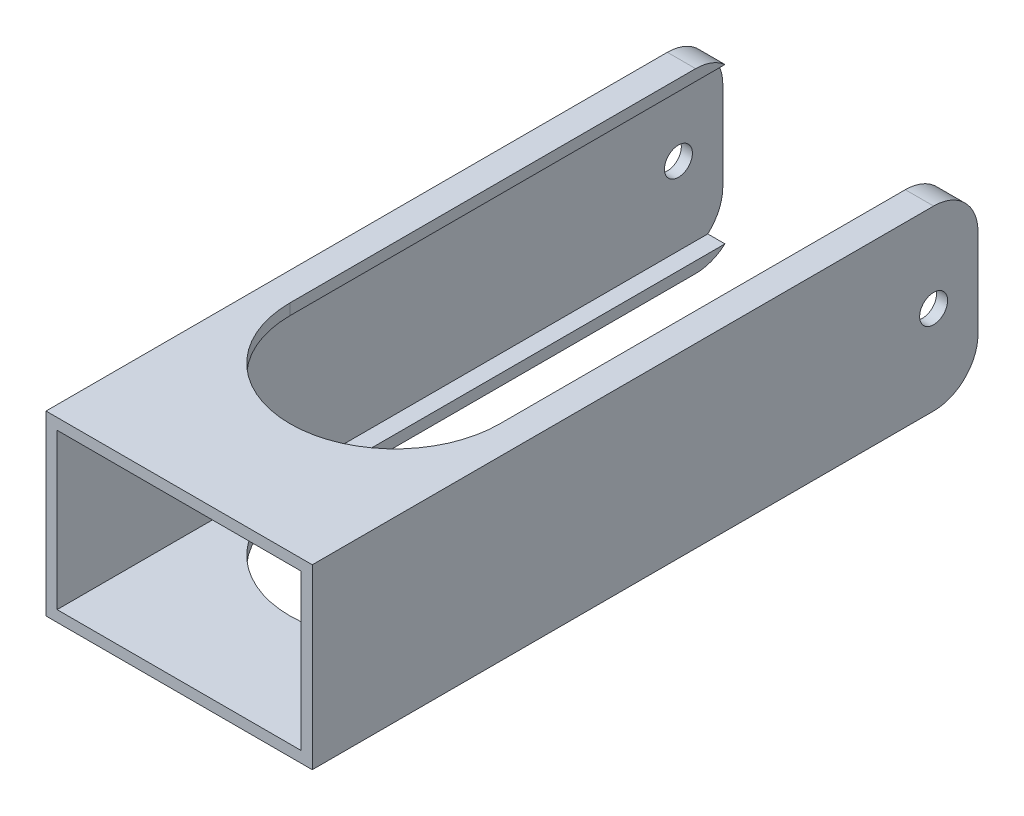
ISO-10303-21;
HEADER;
FILE_DESCRIPTION(('STEP AP214'),'2;1');
FILE_NAME('part.step','',(''),(''),'','','');
FILE_SCHEMA(('AUTOMOTIVE_DESIGN { 1 0 10303 214 1 1 1 1 }'));
ENDSEC;
DATA;
#1=APPLICATION_CONTEXT('core data for automotive mechanical design processes');
#2=APPLICATION_PROTOCOL_DEFINITION('international standard','automotive_design',2000,#1);
#3=PRODUCT_CONTEXT('',#1,'mechanical');
#4=PRODUCT('Part','Part','',(#3));
#5=PRODUCT_RELATED_PRODUCT_CATEGORY('part','',(#4));
#6=PRODUCT_DEFINITION_FORMATION('','',#4);
#7=PRODUCT_DEFINITION_CONTEXT('part definition',#1,'design');
#8=PRODUCT_DEFINITION('design','',#6,#7);
#9=PRODUCT_DEFINITION_SHAPE('','',#8);
#10=(LENGTH_UNIT() NAMED_UNIT(*) SI_UNIT(.MILLI.,.METRE.));
#11=(NAMED_UNIT(*) PLANE_ANGLE_UNIT() SI_UNIT($,.RADIAN.));
#12=(NAMED_UNIT(*) SI_UNIT($,.STERADIAN.) SOLID_ANGLE_UNIT());
#13=UNCERTAINTY_MEASURE_WITH_UNIT(LENGTH_MEASURE(1.E-05),#10,'distance_accuracy_value','');
#14=(GEOMETRIC_REPRESENTATION_CONTEXT(3) GLOBAL_UNCERTAINTY_ASSIGNED_CONTEXT((#13)) GLOBAL_UNIT_ASSIGNED_CONTEXT((#10,
#11,#12)) REPRESENTATION_CONTEXT('',''));
#15=CARTESIAN_POINT('',(0.,0.,0.));
#16=DIRECTION('',(0.,0.,1.));
#17=DIRECTION('',(1.,0.,0.));
#18=AXIS2_PLACEMENT_3D('',#15,#16,#17);
#19=CARTESIAN_POINT('',(0.,0.,-95.25));
#20=DIRECTION('',(0.,0.,1.));
#21=DIRECTION('',(1.,0.,0.));
#22=AXIS2_PLACEMENT_3D('',#19,#20,#21);
#23=PLANE('',#22);
#24=DIRECTION('',(0.,1.,0.));
#25=VECTOR('',#24,1.);
#26=CARTESIAN_POINT('',(38.1,-25.4,-95.25));
#27=LINE('',#26,#25);
#28=CARTESIAN_POINT('',(38.1,-12.7,-95.25));
#29=VERTEX_POINT('',#28);
#30=CARTESIAN_POINT('',(38.1,12.7,-95.25));
#31=VERTEX_POINT('',#30);
#32=EDGE_CURVE('E267',#29,#31,#27,.T.);
#33=ORIENTED_EDGE('',*,*,#32,.F.);
#34=DIRECTION('',(1.,0.,0.));
#35=VECTOR('',#34,1.);
#36=CARTESIAN_POINT('',(0.,-12.7,-95.25));
#37=LINE('',#36,#35);
#38=CARTESIAN_POINT('',(34.925,-12.7,-95.25));
#39=VERTEX_POINT('',#38);
#40=EDGE_CURVE('E65',#29,#39,#37,.F.);
#41=ORIENTED_EDGE('',*,*,#40,.T.);
#42=DIRECTION('',(0.,1.,0.));
#43=VECTOR('',#42,1.);
#44=CARTESIAN_POINT('',(34.925,-22.225,-95.25));
#45=LINE('',#44,#43);
#46=CARTESIAN_POINT('',(34.925,12.7,-95.25));
#47=VERTEX_POINT('',#46);
#48=EDGE_CURVE('E261',#39,#47,#45,.T.);
#49=ORIENTED_EDGE('',*,*,#48,.T.);
#50=DIRECTION('',(-1.,0.,0.));
#51=VECTOR('',#50,1.);
#52=CARTESIAN_POINT('',(0.,12.7,-95.25));
#53=LINE('',#52,#51);
#54=EDGE_CURVE('E380',#47,#31,#53,.F.);
#55=ORIENTED_EDGE('',*,*,#54,.T.);
#56=EDGE_LOOP('',(#33,#41,#49,#55));
#57=FACE_BOUND('',#56,.T.);
#58=ADVANCED_FACE('F40',(#57),#23,.F.);
#59=CARTESIAN_POINT('',(0.,0.,95.25));
#60=DIRECTION('',(0.,0.,1.));
#61=DIRECTION('',(1.,0.,0.));
#62=AXIS2_PLACEMENT_3D('',#59,#60,#61);
#63=PLANE('',#62);
#64=DIRECTION('',(0.,-1.,0.));
#65=VECTOR('',#64,1.);
#66=CARTESIAN_POINT('',(-38.1,-25.4,95.25));
#67=LINE('',#66,#65);
#68=CARTESIAN_POINT('',(-38.1,25.4,95.25));
#69=VERTEX_POINT('',#68);
#70=CARTESIAN_POINT('',(-38.1,-25.4,95.25));
#71=VERTEX_POINT('',#70);
#72=EDGE_CURVE('E295',#69,#71,#67,.T.);
#73=ORIENTED_EDGE('',*,*,#72,.T.);
#74=DIRECTION('',(1.,0.,0.));
#75=VECTOR('',#74,1.);
#76=CARTESIAN_POINT('',(38.1,-25.4,95.25));
#77=LINE('',#76,#75);
#78=CARTESIAN_POINT('',(38.1,-25.4,95.25));
#79=VERTEX_POINT('',#78);
#80=EDGE_CURVE('E298',#71,#79,#77,.T.);
#81=ORIENTED_EDGE('',*,*,#80,.T.);
#82=DIRECTION('',(0.,1.,0.));
#83=VECTOR('',#82,1.);
#84=CARTESIAN_POINT('',(38.1,-25.4,95.25));
#85=LINE('',#84,#83);
#86=CARTESIAN_POINT('',(38.1,25.4,95.25));
#87=VERTEX_POINT('',#86);
#88=EDGE_CURVE('E300',#79,#87,#85,.T.);
#89=ORIENTED_EDGE('',*,*,#88,.T.);
#90=DIRECTION('',(-1.,0.,0.));
#91=VECTOR('',#90,1.);
#92=CARTESIAN_POINT('',(38.1,25.4,95.25));
#93=LINE('',#92,#91);
#94=EDGE_CURVE('E302',#87,#69,#93,.T.);
#95=ORIENTED_EDGE('',*,*,#94,.T.);
#96=EDGE_LOOP('',(#73,#81,#89,#95));
#97=FACE_BOUND('',#96,.T.);
#98=DIRECTION('',(1.,0.,0.));
#99=VECTOR('',#98,1.);
#100=CARTESIAN_POINT('',(34.925,-22.225,95.25));
#101=LINE('',#100,#99);
#102=CARTESIAN_POINT('',(-34.925,-22.225,95.25));
#103=VERTEX_POINT('',#102);
#104=CARTESIAN_POINT('',(34.925,-22.225,95.25));
#105=VERTEX_POINT('',#104);
#106=EDGE_CURVE('E273',#103,#105,#101,.T.);
#107=ORIENTED_EDGE('',*,*,#106,.F.);
#108=DIRECTION('',(0.,-1.,0.));
#109=VECTOR('',#108,1.);
#110=CARTESIAN_POINT('',(-34.925,-22.225,95.25));
#111=LINE('',#110,#109);
#112=CARTESIAN_POINT('',(-34.925,22.225,95.25));
#113=VERTEX_POINT('',#112);
#114=EDGE_CURVE('E271',#113,#103,#111,.T.);
#115=ORIENTED_EDGE('',*,*,#114,.F.);
#116=DIRECTION('',(-1.,0.,0.));
#117=VECTOR('',#116,1.);
#118=CARTESIAN_POINT('',(34.925,22.225,95.25));
#119=LINE('',#118,#117);
#120=CARTESIAN_POINT('',(34.925,22.225,95.25));
#121=VERTEX_POINT('',#120);
#122=EDGE_CURVE('E278',#121,#113,#119,.T.);
#123=ORIENTED_EDGE('',*,*,#122,.F.);
#124=DIRECTION('',(0.,1.,0.));
#125=VECTOR('',#124,1.);
#126=CARTESIAN_POINT('',(34.925,-22.225,95.25));
#127=LINE('',#126,#125);
#128=EDGE_CURVE('E275',#105,#121,#127,.T.);
#129=ORIENTED_EDGE('',*,*,#128,.F.);
#130=EDGE_LOOP('',(#107,#115,#123,#129));
#131=FACE_BOUND('',#130,.T.);
#132=ADVANCED_FACE('F414',(#97,#131),#63,.T.);
#133=CARTESIAN_POINT('',(-38.1,-25.4,95.25));
#134=DIRECTION('',(1.,0.,0.));
#135=DIRECTION('',(0.,0.,-1.));
#136=AXIS2_PLACEMENT_3D('',#133,#134,#135);
#137=PLANE('',#136);
#138=CARTESIAN_POINT('',(-38.1,0.,-82.55));
#139=DIRECTION('',(1.,0.,0.));
#140=DIRECTION('',(0.,0.,-1.));
#141=AXIS2_PLACEMENT_3D('',#138,#139,#140);
#142=CIRCLE('',#141,4.00000000000001);
#143=CARTESIAN_POINT('',(-38.1,0.,-86.55));
#144=VERTEX_POINT('',#143);
#145=EDGE_CURVE('E328',#144,#144,#142,.T.);
#146=ORIENTED_EDGE('',*,*,#145,.T.);
#147=EDGE_LOOP('',(#146));
#148=FACE_BOUND('',#147,.T.);
#149=DIRECTION('',(0.,-1.,0.));
#150=VECTOR('',#149,1.);
#151=CARTESIAN_POINT('',(-38.1,-25.4,-95.25));
#152=LINE('',#151,#150);
#153=CARTESIAN_POINT('',(-38.1,12.7,-95.25));
#154=VERTEX_POINT('',#153);
#155=CARTESIAN_POINT('',(-38.1,-12.7,-95.25));
#156=VERTEX_POINT('',#155);
#157=EDGE_CURVE('E264',#154,#156,#152,.T.);
#158=ORIENTED_EDGE('',*,*,#157,.T.);
#159=CARTESIAN_POINT('',(-38.1,-12.7,-82.55));
#160=DIRECTION('',(1.,0.,0.));
#161=DIRECTION('',(0.,0.,-1.));
#162=AXIS2_PLACEMENT_3D('',#159,#160,#161);
#163=CIRCLE('',#162,12.7);
#164=CARTESIAN_POINT('',(-38.1,-25.4,-82.55));
#165=VERTEX_POINT('',#164);
#166=EDGE_CURVE('E357',#156,#165,#163,.F.);
#167=ORIENTED_EDGE('',*,*,#166,.T.);
#168=DIRECTION('',(0.,0.,-1.));
#169=VECTOR('',#168,1.);
#170=CARTESIAN_POINT('',(-38.1,-25.4,95.25));
#171=LINE('',#170,#169);
#172=EDGE_CURVE('E316',#71,#165,#171,.T.);
#173=ORIENTED_EDGE('',*,*,#172,.F.);
#174=ORIENTED_EDGE('',*,*,#72,.F.);
#175=DIRECTION('',(0.,0.,-1.));
#176=VECTOR('',#175,1.);
#177=CARTESIAN_POINT('',(-38.1,25.4,95.25));
#178=LINE('',#177,#176);
#179=CARTESIAN_POINT('',(-38.1,25.4,-82.55));
#180=VERTEX_POINT('',#179);
#181=EDGE_CURVE('E304',#69,#180,#178,.T.);
#182=ORIENTED_EDGE('',*,*,#181,.T.);
#183=CARTESIAN_POINT('',(-38.1,12.7,-82.55));
#184=DIRECTION('',(1.,0.,0.));
#185=DIRECTION('',(0.,0.,-1.));
#186=AXIS2_PLACEMENT_3D('',#183,#184,#185);
#187=CIRCLE('',#186,12.7);
#188=EDGE_CURVE('E354',#180,#154,#187,.F.);
#189=ORIENTED_EDGE('',*,*,#188,.T.);
#190=EDGE_LOOP('',(#158,#167,#173,#174,#182,#189));
#191=FACE_BOUND('',#190,.T.);
#192=ADVANCED_FACE('F476',(#148,#191),#137,.F.);
#193=CARTESIAN_POINT('',(38.1,-25.4,95.25));
#194=DIRECTION('',(0.,1.,0.));
#195=DIRECTION('',(0.,0.,1.));
#196=AXIS2_PLACEMENT_3D('',#193,#194,#195);
#197=PLANE('',#196);
#198=ORIENTED_EDGE('',*,*,#172,.T.);
#199=DIRECTION('',(1.,0.,0.));
#200=VECTOR('',#199,1.);
#201=CARTESIAN_POINT('',(38.1,-25.4,-82.55));
#202=LINE('',#201,#200);
#203=CARTESIAN_POINT('',(-30.,-25.4,-82.55));
#204=VERTEX_POINT('',#203);
#205=EDGE_CURVE('E202',#165,#204,#202,.T.);
#206=ORIENTED_EDGE('',*,*,#205,.T.);
#207=DIRECTION('',(0.,0.,1.));
#208=VECTOR('',#207,1.);
#209=CARTESIAN_POINT('',(-30.,-25.4,0.));
#210=LINE('',#209,#208);
#211=CARTESIAN_POINT('',(-30.,-25.4,33.5));
#212=VERTEX_POINT('',#211);
#213=EDGE_CURVE('E194',#204,#212,#210,.T.);
#214=ORIENTED_EDGE('',*,*,#213,.T.);
#215=CARTESIAN_POINT('',(0.,-25.4,33.5));
#216=DIRECTION('',(0.,1.,0.));
#217=DIRECTION('',(0.,0.,1.));
#218=AXIS2_PLACEMENT_3D('',#215,#216,#217);
#219=CIRCLE('',#218,30.);
#220=CARTESIAN_POINT('',(30.,-25.4,33.5));
#221=VERTEX_POINT('',#220);
#222=EDGE_CURVE('E200',#212,#221,#219,.T.);
#223=ORIENTED_EDGE('',*,*,#222,.T.);
#224=DIRECTION('',(0.,0.,1.));
#225=VECTOR('',#224,1.);
#226=CARTESIAN_POINT('',(30.,-25.4,0.));
#227=LINE('',#226,#225);
#228=CARTESIAN_POINT('',(30.,-25.4,-82.55));
#229=VERTEX_POINT('',#228);
#230=EDGE_CURVE('E222',#229,#221,#227,.T.);
#231=ORIENTED_EDGE('',*,*,#230,.F.);
#232=DIRECTION('',(1.,0.,0.));
#233=VECTOR('',#232,1.);
#234=CARTESIAN_POINT('',(38.1,-25.4,-82.55));
#235=LINE('',#234,#233);
#236=CARTESIAN_POINT('',(38.1,-25.4,-82.55));
#237=VERTEX_POINT('',#236);
#238=EDGE_CURVE('E321',#229,#237,#235,.T.);
#239=ORIENTED_EDGE('',*,*,#238,.T.);
#240=DIRECTION('',(0.,0.,-1.));
#241=VECTOR('',#240,1.);
#242=CARTESIAN_POINT('',(38.1,-25.4,95.25));
#243=LINE('',#242,#241);
#244=EDGE_CURVE('E312',#79,#237,#243,.T.);
#245=ORIENTED_EDGE('',*,*,#244,.F.);
#246=ORIENTED_EDGE('',*,*,#80,.F.);
#247=EDGE_LOOP('',(#198,#206,#214,#223,#231,#239,#245,#246));
#248=FACE_BOUND('',#247,.T.);
#249=ADVANCED_FACE('F197',(#248),#197,.F.);
#250=CARTESIAN_POINT('',(38.1,-25.4,95.25));
#251=DIRECTION('',(-1.,0.,0.));
#252=DIRECTION('',(0.,0.,1.));
#253=AXIS2_PLACEMENT_3D('',#250,#251,#252);
#254=PLANE('',#253);
#255=CARTESIAN_POINT('',(38.1,0.,-82.55));
#256=DIRECTION('',(1.,0.,0.));
#257=DIRECTION('',(0.,0.,-1.));
#258=AXIS2_PLACEMENT_3D('',#255,#256,#257);
#259=CIRCLE('',#258,4.00000000000001);
#260=CARTESIAN_POINT('',(38.1,0.,-86.55));
#261=VERTEX_POINT('',#260);
#262=EDGE_CURVE('E653',#261,#261,#259,.T.);
#263=ORIENTED_EDGE('',*,*,#262,.F.);
#264=EDGE_LOOP('',(#263));
#265=FACE_BOUND('',#264,.T.);
#266=ORIENTED_EDGE('',*,*,#244,.T.);
#267=CARTESIAN_POINT('',(38.1,-12.7,-82.55));
#268=DIRECTION('',(-1.,0.,0.));
#269=DIRECTION('',(0.,0.,1.));
#270=AXIS2_PLACEMENT_3D('',#267,#268,#269);
#271=CIRCLE('',#270,12.7);
#272=EDGE_CURVE('E377',#237,#29,#271,.F.);
#273=ORIENTED_EDGE('',*,*,#272,.T.);
#274=ORIENTED_EDGE('',*,*,#32,.T.);
#275=CARTESIAN_POINT('',(38.1,12.7,-82.55));
#276=DIRECTION('',(-1.,0.,0.));
#277=DIRECTION('',(0.,0.,1.));
#278=AXIS2_PLACEMENT_3D('',#275,#276,#277);
#279=CIRCLE('',#278,12.7);
#280=CARTESIAN_POINT('',(38.1,25.4,-82.55));
#281=VERTEX_POINT('',#280);
#282=EDGE_CURVE('E375',#31,#281,#279,.F.);
#283=ORIENTED_EDGE('',*,*,#282,.T.);
#284=DIRECTION('',(0.,0.,-1.));
#285=VECTOR('',#284,1.);
#286=CARTESIAN_POINT('',(38.1,25.4,95.25));
#287=LINE('',#286,#285);
#288=EDGE_CURVE('E308',#87,#281,#287,.T.);
#289=ORIENTED_EDGE('',*,*,#288,.F.);
#290=ORIENTED_EDGE('',*,*,#88,.F.);
#291=EDGE_LOOP('',(#266,#273,#274,#283,#289,#290));
#292=FACE_BOUND('',#291,.T.);
#293=ADVANCED_FACE('F399',(#265,#292),#254,.F.);
#294=CARTESIAN_POINT('',(38.1,25.4,95.25));
#295=DIRECTION('',(0.,-1.,0.));
#296=DIRECTION('',(0.,0.,-1.));
#297=AXIS2_PLACEMENT_3D('',#294,#295,#296);
#298=PLANE('',#297);
#299=DIRECTION('',(0.,0.,-1.));
#300=VECTOR('',#299,1.);
#301=CARTESIAN_POINT('',(-30.,25.4,95.25));
#302=LINE('',#301,#300);
#303=CARTESIAN_POINT('',(-30.,25.4,33.5));
#304=VERTEX_POINT('',#303);
#305=CARTESIAN_POINT('',(-30.,25.4,-82.55));
#306=VERTEX_POINT('',#305);
#307=EDGE_CURVE('E251',#304,#306,#302,.T.);
#308=ORIENTED_EDGE('',*,*,#307,.T.);
#309=DIRECTION('',(-1.,0.,0.));
#310=VECTOR('',#309,1.);
#311=CARTESIAN_POINT('',(38.1,25.4,-82.55));
#312=LINE('',#311,#310);
#313=EDGE_CURVE('E363',#306,#180,#312,.T.);
#314=ORIENTED_EDGE('',*,*,#313,.T.);
#315=ORIENTED_EDGE('',*,*,#181,.F.);
#316=ORIENTED_EDGE('',*,*,#94,.F.);
#317=ORIENTED_EDGE('',*,*,#288,.T.);
#318=DIRECTION('',(-1.,0.,0.));
#319=VECTOR('',#318,1.);
#320=CARTESIAN_POINT('',(38.1,25.4,-82.55));
#321=LINE('',#320,#319);
#322=CARTESIAN_POINT('',(30.,25.4,-82.55));
#323=VERTEX_POINT('',#322);
#324=EDGE_CURVE('E360',#281,#323,#321,.T.);
#325=ORIENTED_EDGE('',*,*,#324,.T.);
#326=DIRECTION('',(0.,0.,-1.));
#327=VECTOR('',#326,1.);
#328=CARTESIAN_POINT('',(30.,25.4,95.25));
#329=LINE('',#328,#327);
#330=CARTESIAN_POINT('',(30.,25.4,33.5));
#331=VERTEX_POINT('',#330);
#332=EDGE_CURVE('E241',#331,#323,#329,.T.);
#333=ORIENTED_EDGE('',*,*,#332,.F.);
#334=CARTESIAN_POINT('',(0.,25.4,33.5));
#335=DIRECTION('',(0.,1.,0.));
#336=DIRECTION('',(0.,0.,1.));
#337=AXIS2_PLACEMENT_3D('',#334,#335,#336);
#338=CIRCLE('',#337,30.);
#339=EDGE_CURVE('E257',#304,#331,#338,.T.);
#340=ORIENTED_EDGE('',*,*,#339,.F.);
#341=EDGE_LOOP('',(#308,#314,#315,#316,#317,#325,#333,#340));
#342=FACE_BOUND('',#341,.T.);
#343=ADVANCED_FACE('F409',(#342),#298,.F.);
#344=CARTESIAN_POINT('',(-34.925,-22.225,95.25));
#345=DIRECTION('',(1.,0.,0.));
#346=DIRECTION('',(0.,0.,-1.));
#347=AXIS2_PLACEMENT_3D('',#344,#345,#346);
#348=PLANE('',#347);
#349=CARTESIAN_POINT('',(-34.925,0.,-82.55));
#350=DIRECTION('',(1.,0.,0.));
#351=DIRECTION('',(0.,0.,-1.));
#352=AXIS2_PLACEMENT_3D('',#349,#350,#351);
#353=CIRCLE('',#352,4.00000000000001);
#354=CARTESIAN_POINT('',(-34.925,0.,-86.55));
#355=VERTEX_POINT('',#354);
#356=EDGE_CURVE('E205',#355,#355,#353,.T.);
#357=ORIENTED_EDGE('',*,*,#356,.F.);
#358=EDGE_LOOP('',(#357));
#359=FACE_BOUND('',#358,.T.);
#360=DIRECTION('',(0.,0.,-1.));
#361=VECTOR('',#360,1.);
#362=CARTESIAN_POINT('',(-34.925,-22.225,95.25));
#363=LINE('',#362,#361);
#364=CARTESIAN_POINT('',(-34.925,-22.225,-90.9502604126301));
#365=VERTEX_POINT('',#364);
#366=EDGE_CURVE('E291',#103,#365,#363,.T.);
#367=ORIENTED_EDGE('',*,*,#366,.T.);
#368=CARTESIAN_POINT('',(-34.925,-12.7,-82.55));
#369=DIRECTION('',(1.,0.,0.));
#370=DIRECTION('',(0.,0.,-1.));
#371=AXIS2_PLACEMENT_3D('',#368,#369,#370);
#372=CIRCLE('',#371,12.7);
#373=CARTESIAN_POINT('',(-34.925,-12.7,-95.25));
#374=VERTEX_POINT('',#373);
#375=EDGE_CURVE('E346',#365,#374,#372,.T.);
#376=ORIENTED_EDGE('',*,*,#375,.T.);
#377=DIRECTION('',(0.,-1.,0.));
#378=VECTOR('',#377,1.);
#379=CARTESIAN_POINT('',(-34.925,-22.225,-95.25));
#380=LINE('',#379,#378);
#381=CARTESIAN_POINT('',(-34.925,12.7,-95.25));
#382=VERTEX_POINT('',#381);
#383=EDGE_CURVE('E258',#382,#374,#380,.T.);
#384=ORIENTED_EDGE('',*,*,#383,.F.);
#385=CARTESIAN_POINT('',(-34.925,12.7,-82.55));
#386=DIRECTION('',(1.,0.,0.));
#387=DIRECTION('',(0.,0.,-1.));
#388=AXIS2_PLACEMENT_3D('',#385,#386,#387);
#389=CIRCLE('',#388,12.7);
#390=CARTESIAN_POINT('',(-34.925,22.225,-90.9502604126301));
#391=VERTEX_POINT('',#390);
#392=EDGE_CURVE('E343',#382,#391,#389,.T.);
#393=ORIENTED_EDGE('',*,*,#392,.T.);
#394=DIRECTION('',(0.,0.,-1.));
#395=VECTOR('',#394,1.);
#396=CARTESIAN_POINT('',(-34.925,22.225,95.25));
#397=LINE('',#396,#395);
#398=EDGE_CURVE('E280',#113,#391,#397,.T.);
#399=ORIENTED_EDGE('',*,*,#398,.F.);
#400=ORIENTED_EDGE('',*,*,#114,.T.);
#401=EDGE_LOOP('',(#367,#376,#384,#393,#399,#400));
#402=FACE_BOUND('',#401,.T.);
#403=ADVANCED_FACE('F438',(#359,#402),#348,.T.);
#404=CARTESIAN_POINT('',(34.925,-22.225,95.25));
#405=DIRECTION('',(0.,1.,0.));
#406=DIRECTION('',(0.,0.,1.));
#407=AXIS2_PLACEMENT_3D('',#404,#405,#406);
#408=PLANE('',#407);
#409=DIRECTION('',(0.,0.,1.));
#410=VECTOR('',#409,1.);
#411=CARTESIAN_POINT('',(-30.,-22.225,95.25));
#412=LINE('',#411,#410);
#413=CARTESIAN_POINT('',(-30.,-22.225,-90.9502604126301));
#414=VERTEX_POINT('',#413);
#415=CARTESIAN_POINT('',(-30.,-22.225,33.5));
#416=VERTEX_POINT('',#415);
#417=EDGE_CURVE('E211',#414,#416,#412,.T.);
#418=ORIENTED_EDGE('',*,*,#417,.F.);
#419=DIRECTION('',(1.,0.,0.));
#420=VECTOR('',#419,1.);
#421=CARTESIAN_POINT('',(-30.,-22.225,-90.9502604126301));
#422=LINE('',#421,#420);
#423=EDGE_CURVE('E340',#414,#365,#422,.F.);
#424=ORIENTED_EDGE('',*,*,#423,.T.);
#425=ORIENTED_EDGE('',*,*,#366,.F.);
#426=ORIENTED_EDGE('',*,*,#106,.T.);
#427=DIRECTION('',(0.,0.,-1.));
#428=VECTOR('',#427,1.);
#429=CARTESIAN_POINT('',(34.925,-22.225,95.25));
#430=LINE('',#429,#428);
#431=CARTESIAN_POINT('',(34.925,-22.225,-90.9502604126301));
#432=VERTEX_POINT('',#431);
#433=EDGE_CURVE('E287',#105,#432,#430,.T.);
#434=ORIENTED_EDGE('',*,*,#433,.T.);
#435=DIRECTION('',(1.,0.,0.));
#436=VECTOR('',#435,1.);
#437=CARTESIAN_POINT('',(34.925,-22.225,-90.9502604126301));
#438=LINE('',#437,#436);
#439=CARTESIAN_POINT('',(30.,-22.225,-90.9502604126301));
#440=VERTEX_POINT('',#439);
#441=EDGE_CURVE('E337',#432,#440,#438,.F.);
#442=ORIENTED_EDGE('',*,*,#441,.T.);
#443=DIRECTION('',(0.,0.,1.));
#444=VECTOR('',#443,1.);
#445=CARTESIAN_POINT('',(30.,-22.225,95.25));
#446=LINE('',#445,#444);
#447=CARTESIAN_POINT('',(30.,-22.225,33.5));
#448=VERTEX_POINT('',#447);
#449=EDGE_CURVE('E238',#440,#448,#446,.T.);
#450=ORIENTED_EDGE('',*,*,#449,.T.);
#451=CARTESIAN_POINT('',(0.,-22.225,33.5));
#452=DIRECTION('',(0.,1.,0.));
#453=DIRECTION('',(0.,0.,1.));
#454=AXIS2_PLACEMENT_3D('',#451,#452,#453);
#455=CIRCLE('',#454,30.);
#456=EDGE_CURVE('E255',#416,#448,#455,.T.);
#457=ORIENTED_EDGE('',*,*,#456,.F.);
#458=EDGE_LOOP('',(#418,#424,#425,#426,#434,#442,#450,#457));
#459=FACE_BOUND('',#458,.T.);
#460=ADVANCED_FACE('F425',(#459),#408,.T.);
#461=CARTESIAN_POINT('',(34.925,-22.225,95.25));
#462=DIRECTION('',(-1.,0.,0.));
#463=DIRECTION('',(0.,-1.,0.));
#464=AXIS2_PLACEMENT_3D('',#461,#462,#463);
#465=PLANE('',#464);
#466=CARTESIAN_POINT('',(34.925,0.,-82.55));
#467=DIRECTION('',(-1.,0.,0.));
#468=DIRECTION('',(0.,-1.,0.));
#469=AXIS2_PLACEMENT_3D('',#466,#467,#468);
#470=CIRCLE('',#469,4.00000000000001);
#471=CARTESIAN_POINT('',(34.925,-4.00000000000001,-82.55));
#472=VERTEX_POINT('',#471);
#473=EDGE_CURVE('E324',#472,#472,#470,.T.);
#474=ORIENTED_EDGE('',*,*,#473,.F.);
#475=EDGE_LOOP('',(#474));
#476=FACE_BOUND('',#475,.T.);
#477=ORIENTED_EDGE('',*,*,#48,.F.);
#478=CARTESIAN_POINT('',(34.925,-12.7,-82.55));
#479=DIRECTION('',(-1.,0.,0.));
#480=DIRECTION('',(0.,-1.,0.));
#481=AXIS2_PLACEMENT_3D('',#478,#479,#480);
#482=CIRCLE('',#481,12.7);
#483=EDGE_CURVE('E385',#39,#432,#482,.T.);
#484=ORIENTED_EDGE('',*,*,#483,.T.);
#485=ORIENTED_EDGE('',*,*,#433,.F.);
#486=ORIENTED_EDGE('',*,*,#128,.T.);
#487=DIRECTION('',(0.,0.,-1.));
#488=VECTOR('',#487,1.);
#489=CARTESIAN_POINT('',(34.925,22.225,95.25));
#490=LINE('',#489,#488);
#491=CARTESIAN_POINT('',(34.925,22.225,-90.9502604126301));
#492=VERTEX_POINT('',#491);
#493=EDGE_CURVE('E284',#121,#492,#490,.T.);
#494=ORIENTED_EDGE('',*,*,#493,.T.);
#495=CARTESIAN_POINT('',(34.925,12.7,-82.55));
#496=DIRECTION('',(-1.,0.,0.));
#497=DIRECTION('',(0.,-1.,0.));
#498=AXIS2_PLACEMENT_3D('',#495,#496,#497);
#499=CIRCLE('',#498,12.7);
#500=EDGE_CURVE('E55',#492,#47,#499,.T.);
#501=ORIENTED_EDGE('',*,*,#500,.T.);
#502=EDGE_LOOP('',(#477,#484,#485,#486,#494,#501));
#503=FACE_BOUND('',#502,.T.);
#504=ADVANCED_FACE('F428',(#476,#503),#465,.T.);
#505=CARTESIAN_POINT('',(34.925,22.225,95.25));
#506=DIRECTION('',(0.,-1.,0.));
#507=DIRECTION('',(0.,0.,-1.));
#508=AXIS2_PLACEMENT_3D('',#505,#506,#507);
#509=PLANE('',#508);
#510=ORIENTED_EDGE('',*,*,#398,.T.);
#511=DIRECTION('',(-1.,0.,0.));
#512=VECTOR('',#511,1.);
#513=CARTESIAN_POINT('',(-34.925,22.225,-90.9502604126301));
#514=LINE('',#513,#512);
#515=CARTESIAN_POINT('',(-30.,22.225,-90.9502604126301));
#516=VERTEX_POINT('',#515);
#517=EDGE_CURVE('E369',#391,#516,#514,.F.);
#518=ORIENTED_EDGE('',*,*,#517,.T.);
#519=DIRECTION('',(0.,0.,-1.));
#520=VECTOR('',#519,1.);
#521=CARTESIAN_POINT('',(-30.,22.225,95.25));
#522=LINE('',#521,#520);
#523=CARTESIAN_POINT('',(-30.,22.225,33.5));
#524=VERTEX_POINT('',#523);
#525=EDGE_CURVE('E245',#524,#516,#522,.T.);
#526=ORIENTED_EDGE('',*,*,#525,.F.);
#527=CARTESIAN_POINT('',(0.,22.225,33.5));
#528=DIRECTION('',(0.,-1.,0.));
#529=DIRECTION('',(0.,0.,-1.));
#530=AXIS2_PLACEMENT_3D('',#527,#528,#529);
#531=CIRCLE('',#530,30.);
#532=CARTESIAN_POINT('',(30.,22.225,33.5));
#533=VERTEX_POINT('',#532);
#534=EDGE_CURVE('E319',#533,#524,#531,.T.);
#535=ORIENTED_EDGE('',*,*,#534,.F.);
#536=DIRECTION('',(0.,0.,-1.));
#537=VECTOR('',#536,1.);
#538=CARTESIAN_POINT('',(30.,22.225,95.25));
#539=LINE('',#538,#537);
#540=CARTESIAN_POINT('',(30.,22.225,-90.9502604126301));
#541=VERTEX_POINT('',#540);
#542=EDGE_CURVE('E232',#533,#541,#539,.T.);
#543=ORIENTED_EDGE('',*,*,#542,.T.);
#544=DIRECTION('',(-1.,0.,0.));
#545=VECTOR('',#544,1.);
#546=CARTESIAN_POINT('',(30.,22.225,-90.9502604126301));
#547=LINE('',#546,#545);
#548=EDGE_CURVE('E367',#541,#492,#547,.F.);
#549=ORIENTED_EDGE('',*,*,#548,.T.);
#550=ORIENTED_EDGE('',*,*,#493,.F.);
#551=ORIENTED_EDGE('',*,*,#122,.T.);
#552=EDGE_LOOP('',(#510,#518,#526,#535,#543,#549,#550,#551));
#553=FACE_BOUND('',#552,.T.);
#554=ADVANCED_FACE('F435',(#553),#509,.T.);
#555=ORIENTED_EDGE('',*,*,#383,.T.);
#556=DIRECTION('',(1.,0.,0.));
#557=VECTOR('',#556,1.);
#558=CARTESIAN_POINT('',(0.,-12.7,-95.25));
#559=LINE('',#558,#557);
#560=EDGE_CURVE('E351',#374,#156,#559,.F.);
#561=ORIENTED_EDGE('',*,*,#560,.T.);
#562=ORIENTED_EDGE('',*,*,#157,.F.);
#563=DIRECTION('',(-1.,0.,0.));
#564=VECTOR('',#563,1.);
#565=CARTESIAN_POINT('',(0.,12.7,-95.25));
#566=LINE('',#565,#564);
#567=EDGE_CURVE('E349',#154,#382,#566,.F.);
#568=ORIENTED_EDGE('',*,*,#567,.T.);
#569=EDGE_LOOP('',(#555,#561,#562,#568));
#570=FACE_BOUND('',#569,.T.);
#571=ADVANCED_FACE('F470',(#570),#23,.F.);
#572=CARTESIAN_POINT('',(30.,-25.4,0.));
#573=DIRECTION('',(-1.,0.,0.));
#574=DIRECTION('',(0.,0.,1.));
#575=AXIS2_PLACEMENT_3D('',#572,#573,#574);
#576=PLANE('',#575);
#577=ORIENTED_EDGE('',*,*,#449,.F.);
#578=CARTESIAN_POINT('',(30.,-12.7,-82.55));
#579=DIRECTION('',(-1.,0.,0.));
#580=DIRECTION('',(0.,0.,1.));
#581=AXIS2_PLACEMENT_3D('',#578,#579,#580);
#582=CIRCLE('',#581,12.7);
#583=EDGE_CURVE('E48',#440,#229,#582,.T.);
#584=ORIENTED_EDGE('',*,*,#583,.T.);
#585=ORIENTED_EDGE('',*,*,#230,.T.);
#586=DIRECTION('',(0.,1.,0.));
#587=VECTOR('',#586,1.);
#588=CARTESIAN_POINT('',(30.,-25.4,33.5));
#589=LINE('',#588,#587);
#590=EDGE_CURVE('E221',#221,#448,#589,.T.);
#591=ORIENTED_EDGE('',*,*,#590,.T.);
#592=EDGE_LOOP('',(#577,#584,#585,#591));
#593=FACE_BOUND('',#592,.T.);
#594=ADVANCED_FACE('F391',(#593),#576,.T.);
#595=CARTESIAN_POINT('',(-30.,-25.4,0.));
#596=DIRECTION('',(-1.,0.,0.));
#597=DIRECTION('',(0.,0.,1.));
#598=AXIS2_PLACEMENT_3D('',#595,#596,#597);
#599=PLANE('',#598);
#600=ORIENTED_EDGE('',*,*,#213,.F.);
#601=CARTESIAN_POINT('',(-30.,-12.7,-82.55));
#602=DIRECTION('',(-1.,0.,0.));
#603=DIRECTION('',(0.,0.,1.));
#604=AXIS2_PLACEMENT_3D('',#601,#602,#603);
#605=CIRCLE('',#604,12.7);
#606=EDGE_CURVE('E334',#204,#414,#605,.F.);
#607=ORIENTED_EDGE('',*,*,#606,.T.);
#608=ORIENTED_EDGE('',*,*,#417,.T.);
#609=DIRECTION('',(0.,1.,0.));
#610=VECTOR('',#609,1.);
#611=CARTESIAN_POINT('',(-30.,-25.4,33.5));
#612=LINE('',#611,#610);
#613=EDGE_CURVE('E208',#212,#416,#612,.T.);
#614=ORIENTED_EDGE('',*,*,#613,.F.);
#615=EDGE_LOOP('',(#600,#607,#608,#614));
#616=FACE_BOUND('',#615,.T.);
#617=ADVANCED_FACE('F209',(#616),#599,.F.);
#618=CARTESIAN_POINT('',(0.,-25.4,33.5));
#619=DIRECTION('',(0.,1.,0.));
#620=DIRECTION('',(0.,0.,1.));
#621=AXIS2_PLACEMENT_3D('',#618,#619,#620);
#622=CYLINDRICAL_SURFACE('',#621,30.);
#623=ORIENTED_EDGE('',*,*,#456,.T.);
#624=ORIENTED_EDGE('',*,*,#590,.F.);
#625=ORIENTED_EDGE('',*,*,#222,.F.);
#626=ORIENTED_EDGE('',*,*,#613,.T.);
#627=EDGE_LOOP('',(#623,#624,#625,#626));
#628=FACE_BOUND('',#627,.T.);
#629=ADVANCED_FACE('F219',(#628),#622,.F.);
#630=EDGE_CURVE('E215',#533,#331,#589,.T.);
#631=ORIENTED_EDGE('',*,*,#630,.F.);
#632=ORIENTED_EDGE('',*,*,#534,.T.);
#633=EDGE_CURVE('E216',#524,#304,#612,.T.);
#634=ORIENTED_EDGE('',*,*,#633,.T.);
#635=ORIENTED_EDGE('',*,*,#339,.T.);
#636=EDGE_LOOP('',(#631,#632,#634,#635));
#637=FACE_BOUND('',#636,.T.);
#638=ADVANCED_FACE('F454',(#637),#622,.F.);
#639=ORIENTED_EDGE('',*,*,#525,.T.);
#640=CARTESIAN_POINT('',(-30.,12.7,-82.55));
#641=DIRECTION('',(-1.,0.,0.));
#642=DIRECTION('',(0.,0.,1.));
#643=AXIS2_PLACEMENT_3D('',#640,#641,#642);
#644=CIRCLE('',#643,12.7);
#645=EDGE_CURVE('E372',#516,#306,#644,.F.);
#646=ORIENTED_EDGE('',*,*,#645,.T.);
#647=ORIENTED_EDGE('',*,*,#307,.F.);
#648=ORIENTED_EDGE('',*,*,#633,.F.);
#649=EDGE_LOOP('',(#639,#646,#647,#648));
#650=FACE_BOUND('',#649,.T.);
#651=ADVANCED_FACE('F450',(#650),#599,.F.);
#652=ORIENTED_EDGE('',*,*,#332,.T.);
#653=CARTESIAN_POINT('',(30.,12.7,-82.55));
#654=DIRECTION('',(-1.,0.,0.));
#655=DIRECTION('',(0.,0.,1.));
#656=AXIS2_PLACEMENT_3D('',#653,#654,#655);
#657=CIRCLE('',#656,12.7);
#658=EDGE_CURVE('E11',#323,#541,#657,.T.);
#659=ORIENTED_EDGE('',*,*,#658,.T.);
#660=ORIENTED_EDGE('',*,*,#542,.F.);
#661=ORIENTED_EDGE('',*,*,#630,.T.);
#662=EDGE_LOOP('',(#652,#659,#660,#661));
#663=FACE_BOUND('',#662,.T.);
#664=ADVANCED_FACE('F456',(#663),#576,.T.);
#665=CARTESIAN_POINT('',(-38.1,0.,-82.55));
#666=DIRECTION('',(1.,0.,0.));
#667=DIRECTION('',(0.,0.,-1.));
#668=AXIS2_PLACEMENT_3D('',#665,#666,#667);
#669=CYLINDRICAL_SURFACE('',#668,4.00000000000001);
#670=ORIENTED_EDGE('',*,*,#473,.T.);
#671=EDGE_LOOP('',(#670));
#672=FACE_BOUND('',#671,.T.);
#673=ORIENTED_EDGE('',*,*,#262,.T.);
#674=EDGE_LOOP('',(#673));
#675=FACE_BOUND('',#674,.T.);
#676=ADVANCED_FACE('F458',(#672,#675),#669,.F.);
#677=ORIENTED_EDGE('',*,*,#356,.T.);
#678=EDGE_LOOP('',(#677));
#679=FACE_BOUND('',#678,.T.);
#680=ORIENTED_EDGE('',*,*,#145,.F.);
#681=EDGE_LOOP('',(#680));
#682=FACE_BOUND('',#681,.T.);
#683=ADVANCED_FACE('F464',(#679,#682),#669,.F.);
#684=CARTESIAN_POINT('',(38.1,-12.7,-82.55));
#685=DIRECTION('',(1.,0.,0.));
#686=DIRECTION('',(0.,0.,-1.));
#687=AXIS2_PLACEMENT_3D('',#684,#685,#686);
#688=CYLINDRICAL_SURFACE('',#687,12.7);
#689=ORIENTED_EDGE('',*,*,#166,.F.);
#690=ORIENTED_EDGE('',*,*,#560,.F.);
#691=ORIENTED_EDGE('',*,*,#375,.F.);
#692=ORIENTED_EDGE('',*,*,#423,.F.);
#693=ORIENTED_EDGE('',*,*,#606,.F.);
#694=ORIENTED_EDGE('',*,*,#205,.F.);
#695=EDGE_LOOP('',(#689,#690,#691,#692,#693,#694));
#696=FACE_BOUND('',#695,.T.);
#697=ADVANCED_FACE('F420',(#696),#688,.T.);
#698=CARTESIAN_POINT('',(38.1,12.7,-82.55));
#699=DIRECTION('',(-1.,0.,0.));
#700=DIRECTION('',(0.,0.,1.));
#701=AXIS2_PLACEMENT_3D('',#698,#699,#700);
#702=CYLINDRICAL_SURFACE('',#701,12.7);
#703=ORIENTED_EDGE('',*,*,#392,.F.);
#704=ORIENTED_EDGE('',*,*,#567,.F.);
#705=ORIENTED_EDGE('',*,*,#188,.F.);
#706=ORIENTED_EDGE('',*,*,#313,.F.);
#707=ORIENTED_EDGE('',*,*,#645,.F.);
#708=ORIENTED_EDGE('',*,*,#517,.F.);
#709=EDGE_LOOP('',(#703,#704,#705,#706,#707,#708));
#710=FACE_BOUND('',#709,.T.);
#711=ADVANCED_FACE('F443',(#710),#702,.T.);
#712=CARTESIAN_POINT('',(38.1,-12.7,-82.55));
#713=DIRECTION('',(1.,0.,0.));
#714=DIRECTION('',(0.,0.,-1.));
#715=AXIS2_PLACEMENT_3D('',#712,#713,#714);
#716=CYLINDRICAL_SURFACE('',#715,12.7);
#717=ORIENTED_EDGE('',*,*,#483,.F.);
#718=ORIENTED_EDGE('',*,*,#40,.F.);
#719=ORIENTED_EDGE('',*,*,#272,.F.);
#720=ORIENTED_EDGE('',*,*,#238,.F.);
#721=ORIENTED_EDGE('',*,*,#583,.F.);
#722=ORIENTED_EDGE('',*,*,#441,.F.);
#723=EDGE_LOOP('',(#717,#718,#719,#720,#721,#722));
#724=FACE_BOUND('',#723,.T.);
#725=ADVANCED_FACE('F397',(#724),#716,.T.);
#726=CARTESIAN_POINT('',(38.1,12.7,-82.55));
#727=DIRECTION('',(-1.,0.,0.));
#728=DIRECTION('',(0.,0.,1.));
#729=AXIS2_PLACEMENT_3D('',#726,#727,#728);
#730=CYLINDRICAL_SURFACE('',#729,12.7);
#731=ORIENTED_EDGE('',*,*,#282,.F.);
#732=ORIENTED_EDGE('',*,*,#54,.F.);
#733=ORIENTED_EDGE('',*,*,#500,.F.);
#734=ORIENTED_EDGE('',*,*,#548,.F.);
#735=ORIENTED_EDGE('',*,*,#658,.F.);
#736=ORIENTED_EDGE('',*,*,#324,.F.);
#737=EDGE_LOOP('',(#731,#732,#733,#734,#735,#736));
#738=FACE_BOUND('',#737,.T.);
#739=ADVANCED_FACE('F42',(#738),#730,.T.);
#740=CLOSED_SHELL('',(#58,#132,#192,#249,#293,#343,#403,#460,#504,#554,#571,#594,#617,#629,#638,
#651,#664,#676,#683,#697,#711,#725,#739));
#741=MANIFOLD_SOLID_BREP('B2',#740);
#742=ADVANCED_BREP_SHAPE_REPRESENTATION('',(#18,#741),#14);
#743=SHAPE_DEFINITION_REPRESENTATION(#9,#742);
ENDSEC;
END-ISO-10303-21;
